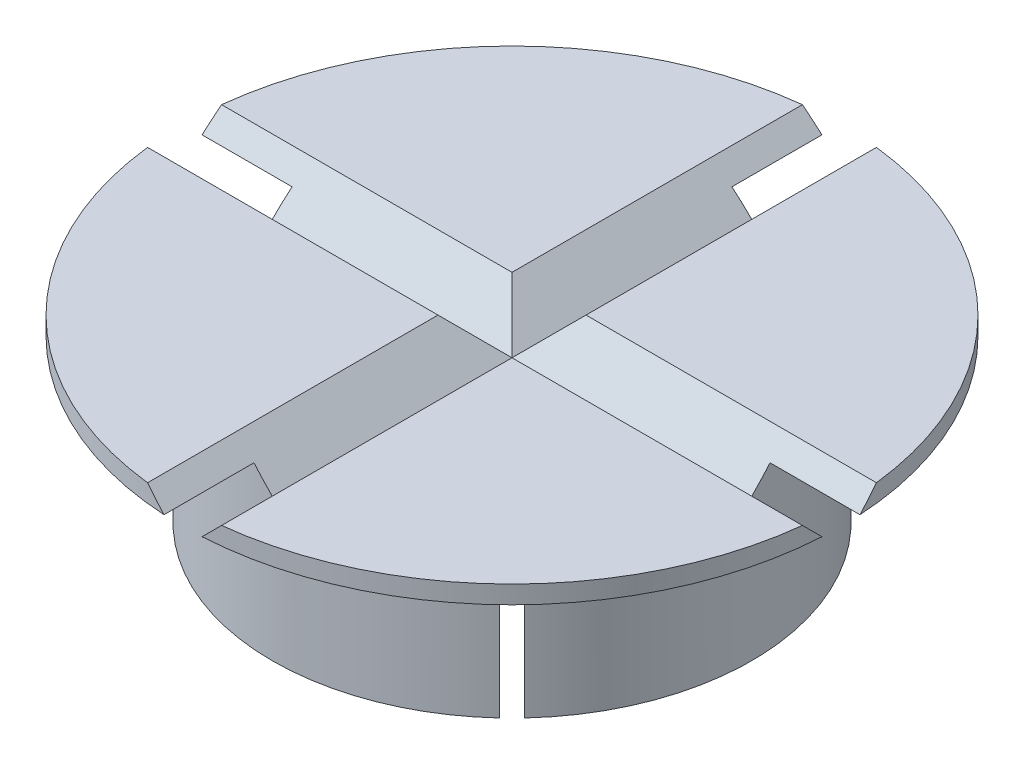
ISO-10303-21;
HEADER;
FILE_DESCRIPTION(('STEP AP214'),'2;1');
FILE_NAME('part.step','',(''),(''),'','','');
FILE_SCHEMA(('AUTOMOTIVE_DESIGN { 1 0 10303 214 1 1 1 1 }'));
ENDSEC;
DATA;
#1=APPLICATION_CONTEXT('core data for automotive mechanical design processes');
#2=APPLICATION_PROTOCOL_DEFINITION('international standard','automotive_design',2000,#1);
#3=PRODUCT_CONTEXT('',#1,'mechanical');
#4=PRODUCT('Part','Part','',(#3));
#5=PRODUCT_RELATED_PRODUCT_CATEGORY('part','',(#4));
#6=PRODUCT_DEFINITION_FORMATION('','',#4);
#7=PRODUCT_DEFINITION_CONTEXT('part definition',#1,'design');
#8=PRODUCT_DEFINITION('design','',#6,#7);
#9=PRODUCT_DEFINITION_SHAPE('','',#8);
#10=(LENGTH_UNIT() NAMED_UNIT(*) SI_UNIT(.MILLI.,.METRE.));
#11=(NAMED_UNIT(*) PLANE_ANGLE_UNIT() SI_UNIT($,.RADIAN.));
#12=(NAMED_UNIT(*) SI_UNIT($,.STERADIAN.) SOLID_ANGLE_UNIT());
#13=UNCERTAINTY_MEASURE_WITH_UNIT(LENGTH_MEASURE(1.E-05),#10,'distance_accuracy_value','');
#14=(GEOMETRIC_REPRESENTATION_CONTEXT(3) GLOBAL_UNCERTAINTY_ASSIGNED_CONTEXT((#13)) GLOBAL_UNIT_ASSIGNED_CONTEXT((#10,
#11,#12)) REPRESENTATION_CONTEXT('',''));
#15=CARTESIAN_POINT('',(0.,0.,0.));
#16=DIRECTION('',(0.,0.,1.));
#17=DIRECTION('',(1.,0.,0.));
#18=AXIS2_PLACEMENT_3D('',#15,#16,#17);
#19=CARTESIAN_POINT('',(0.,0.,0.));
#20=DIRECTION('',(0.,1.,0.));
#21=DIRECTION('',(0.,0.,1.));
#22=AXIS2_PLACEMENT_3D('',#19,#20,#21);
#23=PLANE('',#22);
#24=DIRECTION('',(-0.707106781186544,0.,0.707106781186551));
#25=VECTOR('',#24,1.);
#26=CARTESIAN_POINT('',(25.2340766922016,-3.2211462249284E-13,-26.6482902545749));
#27=LINE('',#26,#25);
#28=CARTESIAN_POINT('',(18.1593979295434,-2.36598536578077E-13,-19.5736114919167));
#29=VERTEX_POINT('',#28);
#30=CARTESIAN_POINT('',(16.0717862097112,-2.11364262460624E-13,-17.4859997720845));
#31=VERTEX_POINT('',#30);
#32=EDGE_CURVE('E263',#29,#31,#27,.T.);
#33=ORIENTED_EDGE('',*,*,#32,.T.);
#34=CARTESIAN_POINT('',(0.,0.,0.));
#35=DIRECTION('',(0.,-1.,0.));
#36=DIRECTION('',(0.,0.,-1.));
#37=AXIS2_PLACEMENT_3D('',#34,#35,#36);
#38=CIRCLE('',#37,23.75);
#39=CARTESIAN_POINT('',(-16.0717862097115,-2.02817018652179E-13,-17.4859997720841));
#40=VERTEX_POINT('',#39);
#41=EDGE_CURVE('E427',#40,#31,#38,.T.);
#42=ORIENTED_EDGE('',*,*,#41,.F.);
#43=DIRECTION('',(0.707106781186559,0.,0.707106781186536));
#44=VECTOR('',#43,1.);
#45=CARTESIAN_POINT('',(-25.2340766922021,-3.13567378684393E-13,-26.6482902545744));
#46=LINE('',#45,#44);
#47=CARTESIAN_POINT('',(-18.1593979295438,-2.28051292769631E-13,-19.5736114919163));
#48=VERTEX_POINT('',#47);
#49=EDGE_CURVE('E492',#48,#40,#46,.T.);
#50=ORIENTED_EDGE('',*,*,#49,.F.);
#51=CARTESIAN_POINT('',(0.,1.6306400674182E-13,0.));
#52=DIRECTION('',(0.,1.,0.));
#53=DIRECTION('',(0.,0.,1.));
#54=AXIS2_PLACEMENT_3D('',#51,#52,#53);
#55=CIRCLE('',#54,26.7);
#56=EDGE_CURVE('E271',#29,#48,#55,.T.);
#57=ORIENTED_EDGE('',*,*,#56,.F.);
#58=EDGE_LOOP('',(#33,#42,#50,#57));
#59=FACE_BOUND('',#58,.T.);
#60=ADVANCED_FACE('F35',(#59),#23,.F.);
#61=CARTESIAN_POINT('',(0.,20.,-1.20876281148109E-13));
#62=DIRECTION('',(0.,1.,0.));
#63=DIRECTION('',(0.,0.,1.));
#64=AXIS2_PLACEMENT_3D('',#61,#62,#63);
#65=CYLINDRICAL_SURFACE('',#64,26.6999999999999);
#66=CARTESIAN_POINT('',(0.,15.8786796564404,0.));
#67=DIRECTION('',(0.,-0.707106781186543,0.707106781186553));
#68=DIRECTION('',(0.,0.707106781186553,0.707106781186543));
#69=AXIS2_PLACEMENT_3D('',#66,#67,#68);
#70=ELLIPSE('',#69,37.7595021153616,26.6999999999999);
#71=CARTESIAN_POINT('',(-26.6155969311228,18.0000000000002,2.12132034355965));
#72=VERTEX_POINT('',#71);
#73=CARTESIAN_POINT('',(-26.6999999999999,15.8786796564405,0.));
#74=VERTEX_POINT('',#73);
#75=EDGE_CURVE('E394',#72,#74,#70,.T.);
#76=ORIENTED_EDGE('',*,*,#75,.T.);
#77=CARTESIAN_POINT('',(0.,15.8786796564404,0.));
#78=DIRECTION('',(0.,-0.707106781186551,-0.707106781186544));
#79=DIRECTION('',(0.,0.707106781186544,-0.707106781186551));
#80=AXIS2_PLACEMENT_3D('',#77,#78,#79);
#81=ELLIPSE('',#80,37.7595021153616,26.6999999999999);
#82=CARTESIAN_POINT('',(-26.6155969311228,18.0000000000002,-2.12132034355969));
#83=VERTEX_POINT('',#82);
#84=EDGE_CURVE('E387',#74,#83,#81,.T.);
#85=ORIENTED_EDGE('',*,*,#84,.T.);
#86=CARTESIAN_POINT('',(0.,18.0000000000002,-1.08788653033299E-13));
#87=DIRECTION('',(0.,1.,0.));
#88=DIRECTION('',(0.,0.,1.));
#89=AXIS2_PLACEMENT_3D('',#86,#87,#88);
#90=CIRCLE('',#89,26.6999999999999);
#91=CARTESIAN_POINT('',(-2.12132034355967,18.,-26.6155969311229));
#92=VERTEX_POINT('',#91);
#93=EDGE_CURVE('E284',#92,#83,#90,.T.);
#94=ORIENTED_EDGE('',*,*,#93,.F.);
#95=CARTESIAN_POINT('',(0.,15.8786796564404,0.));
#96=DIRECTION('',(-0.707106781186548,-0.707106781186547,0.));
#97=DIRECTION('',(-0.707106781186547,0.707106781186548,0.));
#98=AXIS2_PLACEMENT_3D('',#95,#96,#97);
#99=ELLIPSE('',#98,37.7595021153616,26.6999999999999);
#100=CARTESIAN_POINT('',(0.,15.8786796564404,-26.7));
#101=VERTEX_POINT('',#100);
#102=EDGE_CURVE('E355',#92,#101,#99,.T.);
#103=ORIENTED_EDGE('',*,*,#102,.T.);
#104=CARTESIAN_POINT('',(0.,15.8786796564404,0.));
#105=DIRECTION('',(0.707106781186548,-0.707106781186547,0.));
#106=DIRECTION('',(0.707106781186547,0.707106781186548,0.));
#107=AXIS2_PLACEMENT_3D('',#104,#105,#106);
#108=ELLIPSE('',#107,37.7595021153616,26.6999999999999);
#109=CARTESIAN_POINT('',(2.12132034355967,18.,-26.6155969311229));
#110=VERTEX_POINT('',#109);
#111=EDGE_CURVE('E339',#101,#110,#108,.T.);
#112=ORIENTED_EDGE('',*,*,#111,.T.);
#113=CARTESIAN_POINT('',(26.6155969311228,18.0000000000002,-2.12132034356019));
#114=VERTEX_POINT('',#113);
#115=EDGE_CURVE('E283',#114,#110,#90,.T.);
#116=ORIENTED_EDGE('',*,*,#115,.F.);
#117=CARTESIAN_POINT('',(0.,15.8786796564404,0.));
#118=DIRECTION('',(0.,-0.707106781186551,-0.707106781186544));
#119=DIRECTION('',(0.,0.707106781186544,-0.707106781186551));
#120=AXIS2_PLACEMENT_3D('',#117,#118,#119);
#121=ELLIPSE('',#120,37.7595021153616,26.6999999999999);
#122=CARTESIAN_POINT('',(26.6999999999999,15.8786796564402,-1.89190339067742E-13));
#123=VERTEX_POINT('',#122);
#124=EDGE_CURVE('E369',#114,#123,#121,.T.);
#125=ORIENTED_EDGE('',*,*,#124,.T.);
#126=CARTESIAN_POINT('',(0.,15.8786796564404,0.));
#127=DIRECTION('',(0.,-0.707106781186543,0.707106781186553));
#128=DIRECTION('',(0.,0.707106781186553,0.707106781186543));
#129=AXIS2_PLACEMENT_3D('',#126,#127,#128);
#130=ELLIPSE('',#129,37.7595021153616,26.6999999999999);
#131=CARTESIAN_POINT('',(26.6155969311228,18.0000000000002,2.12132034355979));
#132=VERTEX_POINT('',#131);
#133=EDGE_CURVE('E378',#123,#132,#130,.T.);
#134=ORIENTED_EDGE('',*,*,#133,.T.);
#135=CARTESIAN_POINT('',(2.12132034355999,18.0000000000003,26.6155969311227));
#136=VERTEX_POINT('',#135);
#137=EDGE_CURVE('E277',#136,#132,#90,.T.);
#138=ORIENTED_EDGE('',*,*,#137,.F.);
#139=CARTESIAN_POINT('',(0.,15.8786796564404,26.6999999999998));
#140=VERTEX_POINT('',#139);
#141=EDGE_CURVE('E331',#136,#140,#108,.T.);
#142=ORIENTED_EDGE('',*,*,#141,.T.);
#143=CARTESIAN_POINT('',(-2.12132034355999,18.0000000000003,26.6155969311227));
#144=VERTEX_POINT('',#143);
#145=EDGE_CURVE('E357',#140,#144,#99,.T.);
#146=ORIENTED_EDGE('',*,*,#145,.T.);
#147=EDGE_CURVE('E289',#72,#144,#90,.T.);
#148=ORIENTED_EDGE('',*,*,#147,.F.);
#149=EDGE_LOOP('',(#76,#85,#94,#103,#112,#116,#125,#134,#138,#142,#146,#148));
#150=FACE_BOUND('',#149,.T.);
#151=DIRECTION('',(0.,1.,0.));
#152=VECTOR('',#151,1.);
#153=CARTESIAN_POINT('',(18.1593979295433,19.9999999999999,-19.5736114919169));
#154=LINE('',#153,#152);
#155=CARTESIAN_POINT('',(18.1593979295434,11.9999999999998,-19.5736114919168));
#156=VERTEX_POINT('',#155);
#157=EDGE_CURVE('E498',#29,#156,#154,.T.);
#158=ORIENTED_EDGE('',*,*,#157,.F.);
#159=ORIENTED_EDGE('',*,*,#56,.T.);
#160=DIRECTION('',(0.,1.,0.));
#161=VECTOR('',#160,1.);
#162=CARTESIAN_POINT('',(-18.1593979295439,19.9999999999999,-19.5736114919164));
#163=LINE('',#162,#161);
#164=CARTESIAN_POINT('',(-18.1593979295438,11.9999999999998,-19.5736114919163));
#165=VERTEX_POINT('',#164);
#166=EDGE_CURVE('E463',#48,#165,#163,.T.);
#167=ORIENTED_EDGE('',*,*,#166,.T.);
#168=CARTESIAN_POINT('',(0.,12.,0.));
#169=DIRECTION('',(0.,-1.,0.));
#170=DIRECTION('',(1.,0.,0.));
#171=AXIS2_PLACEMENT_3D('',#168,#169,#170);
#172=CIRCLE('',#171,26.6999999999999);
#173=CARTESIAN_POINT('',(-19.5736114919169,11.9999999999998,-18.1593979295432));
#174=VERTEX_POINT('',#173);
#175=EDGE_CURVE('E452',#174,#165,#172,.T.);
#176=ORIENTED_EDGE('',*,*,#175,.F.);
#177=DIRECTION('',(0.,1.,0.));
#178=VECTOR('',#177,1.);
#179=CARTESIAN_POINT('',(-19.5736114919169,19.9999999999999,-18.1593979295432));
#180=LINE('',#179,#178);
#181=CARTESIAN_POINT('',(-19.5736114919169,-2.28051292769631E-13,-18.1593979295432));
#182=VERTEX_POINT('',#181);
#183=EDGE_CURVE('E459',#182,#174,#180,.T.);
#184=ORIENTED_EDGE('',*,*,#183,.F.);
#185=CARTESIAN_POINT('',(-19.5736114919165,0.,18.1593979295436));
#186=VERTEX_POINT('',#185);
#187=EDGE_CURVE('E273',#182,#186,#55,.T.);
#188=ORIENTED_EDGE('',*,*,#187,.T.);
#189=DIRECTION('',(0.,1.,0.));
#190=VECTOR('',#189,1.);
#191=CARTESIAN_POINT('',(-19.5736114919164,20.0000000000001,18.1593979295435));
#192=LINE('',#191,#190);
#193=CARTESIAN_POINT('',(-19.5736114919165,12.,18.1593979295436));
#194=VERTEX_POINT('',#193);
#195=EDGE_CURVE('E440',#186,#194,#192,.T.);
#196=ORIENTED_EDGE('',*,*,#195,.T.);
#197=CARTESIAN_POINT('',(0.,12.,0.));
#198=DIRECTION('',(0.,-1.,0.));
#199=DIRECTION('',(0.,0.,-1.));
#200=AXIS2_PLACEMENT_3D('',#197,#198,#199);
#201=CIRCLE('',#200,26.6999999999999);
#202=CARTESIAN_POINT('',(-18.1593979295434,12.,19.5736114919166));
#203=VERTEX_POINT('',#202);
#204=EDGE_CURVE('E432',#203,#194,#201,.T.);
#205=ORIENTED_EDGE('',*,*,#204,.F.);
#206=DIRECTION('',(0.,1.,0.));
#207=VECTOR('',#206,1.);
#208=CARTESIAN_POINT('',(-18.1593979295433,20.0000000000001,19.5736114919166));
#209=LINE('',#208,#207);
#210=CARTESIAN_POINT('',(-18.1593979295434,0.,19.5736114919167));
#211=VERTEX_POINT('',#210);
#212=EDGE_CURVE('E435',#211,#203,#209,.T.);
#213=ORIENTED_EDGE('',*,*,#212,.F.);
#214=CARTESIAN_POINT('',(18.1593979295437,0.,19.5736114919164));
#215=VERTEX_POINT('',#214);
#216=EDGE_CURVE('E270',#211,#215,#55,.T.);
#217=ORIENTED_EDGE('',*,*,#216,.T.);
#218=DIRECTION('',(0.,1.,0.));
#219=VECTOR('',#218,1.);
#220=CARTESIAN_POINT('',(18.1593979295437,20.0000000000001,19.5736114919162));
#221=LINE('',#220,#219);
#222=CARTESIAN_POINT('',(18.1593979295437,12.,19.5736114919163));
#223=VERTEX_POINT('',#222);
#224=EDGE_CURVE('E473',#215,#223,#221,.T.);
#225=ORIENTED_EDGE('',*,*,#224,.T.);
#226=CARTESIAN_POINT('',(0.,12.,0.));
#227=DIRECTION('',(0.,-1.,0.));
#228=DIRECTION('',(0.,0.,-1.));
#229=AXIS2_PLACEMENT_3D('',#226,#227,#228);
#230=CIRCLE('',#229,26.6999999999999);
#231=CARTESIAN_POINT('',(19.5736114919168,12.,18.1593979295432));
#232=VERTEX_POINT('',#231);
#233=EDGE_CURVE('E457',#232,#223,#230,.T.);
#234=ORIENTED_EDGE('',*,*,#233,.F.);
#235=DIRECTION('',(0.,1.,0.));
#236=VECTOR('',#235,1.);
#237=CARTESIAN_POINT('',(19.5736114919168,20.0000000000001,18.1593979295431));
#238=LINE('',#237,#236);
#239=CARTESIAN_POINT('',(19.5736114919167,0.,18.1593979295433));
#240=VERTEX_POINT('',#239);
#241=EDGE_CURVE('E269',#240,#232,#238,.T.);
#242=ORIENTED_EDGE('',*,*,#241,.F.);
#243=CARTESIAN_POINT('',(19.5736114919165,-2.19504048961189E-13,-18.1593979295436));
#244=VERTEX_POINT('',#243);
#245=EDGE_CURVE('E261',#240,#244,#55,.T.);
#246=ORIENTED_EDGE('',*,*,#245,.T.);
#247=DIRECTION('',(0.,1.,0.));
#248=VECTOR('',#247,1.);
#249=CARTESIAN_POINT('',(19.5736114919164,19.9999999999999,-18.1593979295438));
#250=LINE('',#249,#248);
#251=CARTESIAN_POINT('',(19.5736114919165,11.9999999999998,-18.1593979295437));
#252=VERTEX_POINT('',#251);
#253=EDGE_CURVE('E245',#244,#252,#250,.T.);
#254=ORIENTED_EDGE('',*,*,#253,.T.);
#255=CARTESIAN_POINT('',(0.,12.,0.));
#256=DIRECTION('',(0.,-1.,0.));
#257=DIRECTION('',(0.,0.,-1.));
#258=AXIS2_PLACEMENT_3D('',#255,#256,#257);
#259=CIRCLE('',#258,26.6999999999999);
#260=EDGE_CURVE('E494',#156,#252,#259,.T.);
#261=ORIENTED_EDGE('',*,*,#260,.F.);
#262=EDGE_LOOP('',(#158,#159,#167,#176,#184,#188,#196,#205,#213,#217,#225,#234,#242,#246,#254,#261));
#263=FACE_BOUND('',#262,.T.);
#264=ADVANCED_FACE('F267',(#150,#263),#65,.T.);
#265=CARTESIAN_POINT('',(0.,12.,0.));
#266=DIRECTION('',(0.,-1.,0.));
#267=DIRECTION('',(0.,0.,-1.));
#268=AXIS2_PLACEMENT_3D('',#265,#266,#267);
#269=CYLINDRICAL_SURFACE('',#268,23.75);
#270=DIRECTION('',(0.,-1.,0.));
#271=VECTOR('',#270,1.);
#272=CARTESIAN_POINT('',(16.0717862097112,11.9999999999999,-17.4859997720846));
#273=LINE('',#272,#271);
#274=CARTESIAN_POINT('',(16.0717862097112,11.9999999999998,-17.4859997720846));
#275=VERTEX_POINT('',#274);
#276=EDGE_CURVE('E253',#275,#31,#273,.T.);
#277=ORIENTED_EDGE('',*,*,#276,.F.);
#278=CARTESIAN_POINT('',(0.,12.,0.));
#279=DIRECTION('',(0.,-1.,0.));
#280=DIRECTION('',(0.,0.,-1.));
#281=AXIS2_PLACEMENT_3D('',#278,#279,#280);
#282=CIRCLE('',#281,23.75);
#283=CARTESIAN_POINT('',(-16.0717862097116,11.9999999999999,-17.4859997720842));
#284=VERTEX_POINT('',#283);
#285=EDGE_CURVE('E430',#284,#275,#282,.T.);
#286=ORIENTED_EDGE('',*,*,#285,.F.);
#287=DIRECTION('',(0.,-1.,0.));
#288=VECTOR('',#287,1.);
#289=CARTESIAN_POINT('',(-16.0717862097116,11.9999999999999,-17.4859997720842));
#290=LINE('',#289,#288);
#291=EDGE_CURVE('E466',#284,#40,#290,.T.);
#292=ORIENTED_EDGE('',*,*,#291,.T.);
#293=ORIENTED_EDGE('',*,*,#41,.T.);
#294=EDGE_LOOP('',(#277,#286,#292,#293));
#295=FACE_BOUND('',#294,.T.);
#296=ADVANCED_FACE('F514',(#295),#269,.F.);
#297=DIRECTION('',(0.707106781186559,0.,0.707106781186536));
#298=VECTOR('',#297,1.);
#299=CARTESIAN_POINT('',(-26.6482902545752,-3.13567378684393E-13,-25.2340766922013));
#300=LINE('',#299,#298);
#301=CARTESIAN_POINT('',(-17.4859997720846,-2.02817018652178E-13,-16.071786209711));
#302=VERTEX_POINT('',#301);
#303=EDGE_CURVE('E488',#182,#302,#300,.T.);
#304=ORIENTED_EDGE('',*,*,#303,.T.);
#305=CARTESIAN_POINT('',(-17.4859997720843,0.,16.0717862097114));
#306=VERTEX_POINT('',#305);
#307=EDGE_CURVE('E423',#306,#302,#38,.T.);
#308=ORIENTED_EDGE('',*,*,#307,.F.);
#309=DIRECTION('',(0.707106781186544,0.,-0.707106781186551));
#310=VECTOR('',#309,1.);
#311=CARTESIAN_POINT('',(-26.6482902545747,0.,25.2340766922018));
#312=LINE('',#311,#310);
#313=EDGE_CURVE('E450',#186,#306,#312,.T.);
#314=ORIENTED_EDGE('',*,*,#313,.F.);
#315=ORIENTED_EDGE('',*,*,#187,.F.);
#316=EDGE_LOOP('',(#304,#308,#314,#315));
#317=FACE_BOUND('',#316,.T.);
#318=ADVANCED_FACE('F561',(#317),#23,.F.);
#319=CARTESIAN_POINT('',(17.4859997720843,-1.94269774843737E-13,-16.0717862097114));
#320=VERTEX_POINT('',#319);
#321=CARTESIAN_POINT('',(17.4859997720845,0.,16.0717862097111));
#322=VERTEX_POINT('',#321);
#323=EDGE_CURVE('E262',#320,#322,#38,.T.);
#324=ORIENTED_EDGE('',*,*,#323,.F.);
#325=DIRECTION('',(-0.707106781186544,0.,0.707106781186551));
#326=VECTOR('',#325,1.);
#327=CARTESIAN_POINT('',(26.6482902545747,-3.05020134875953E-13,-25.2340766922018));
#328=LINE('',#327,#326);
#329=EDGE_CURVE('E248',#244,#320,#328,.T.);
#330=ORIENTED_EDGE('',*,*,#329,.F.);
#331=ORIENTED_EDGE('',*,*,#245,.F.);
#332=DIRECTION('',(-0.707106781186554,0.,-0.707106781186541));
#333=VECTOR('',#332,1.);
#334=CARTESIAN_POINT('',(26.648290254575,0.,25.2340766922015));
#335=LINE('',#334,#333);
#336=EDGE_CURVE('E480',#240,#322,#335,.T.);
#337=ORIENTED_EDGE('',*,*,#336,.T.);
#338=EDGE_LOOP('',(#324,#330,#331,#337));
#339=FACE_BOUND('',#338,.T.);
#340=ADVANCED_FACE('F259',(#339),#23,.F.);
#341=DIRECTION('',(0.,-1.,0.));
#342=VECTOR('',#341,1.);
#343=CARTESIAN_POINT('',(-17.4859997720846,11.9999999999999,-16.071786209711));
#344=LINE('',#343,#342);
#345=CARTESIAN_POINT('',(-17.4859997720847,11.9999999999998,-16.071786209711));
#346=VERTEX_POINT('',#345);
#347=EDGE_CURVE('E461',#346,#302,#344,.T.);
#348=ORIENTED_EDGE('',*,*,#347,.F.);
#349=CARTESIAN_POINT('',(-17.4859997720843,12.0000000000001,16.0717862097113));
#350=VERTEX_POINT('',#349);
#351=EDGE_CURVE('E422',#350,#346,#282,.T.);
#352=ORIENTED_EDGE('',*,*,#351,.F.);
#353=DIRECTION('',(0.,-1.,0.));
#354=VECTOR('',#353,1.);
#355=CARTESIAN_POINT('',(-17.4859997720843,12.0000000000001,16.0717862097113));
#356=LINE('',#355,#354);
#357=EDGE_CURVE('E442',#350,#306,#356,.T.);
#358=ORIENTED_EDGE('',*,*,#357,.T.);
#359=ORIENTED_EDGE('',*,*,#307,.T.);
#360=EDGE_LOOP('',(#348,#352,#358,#359));
#361=FACE_BOUND('',#360,.T.);
#362=ADVANCED_FACE('F550',(#361),#269,.F.);
#363=CARTESIAN_POINT('',(17.4859997720843,11.9999999999999,-16.0717862097115));
#364=VERTEX_POINT('',#363);
#365=CARTESIAN_POINT('',(17.4859997720845,12.,16.071786209711));
#366=VERTEX_POINT('',#365);
#367=EDGE_CURVE('E431',#364,#366,#282,.T.);
#368=ORIENTED_EDGE('',*,*,#367,.F.);
#369=DIRECTION('',(0.,-1.,0.));
#370=VECTOR('',#369,1.);
#371=CARTESIAN_POINT('',(17.4859997720843,11.9999999999999,-16.0717862097115));
#372=LINE('',#371,#370);
#373=EDGE_CURVE('E254',#364,#320,#372,.T.);
#374=ORIENTED_EDGE('',*,*,#373,.T.);
#375=ORIENTED_EDGE('',*,*,#323,.T.);
#376=DIRECTION('',(0.,-1.,0.));
#377=VECTOR('',#376,1.);
#378=CARTESIAN_POINT('',(17.4859997720845,12.0000000000001,16.071786209711));
#379=LINE('',#378,#377);
#380=EDGE_CURVE('E470',#366,#322,#379,.T.);
#381=ORIENTED_EDGE('',*,*,#380,.F.);
#382=EDGE_LOOP('',(#368,#374,#375,#381));
#383=FACE_BOUND('',#382,.T.);
#384=ADVANCED_FACE('F534',(#383),#269,.F.);
#385=CARTESIAN_POINT('',(16.0717862097114,0.,17.4859997720842));
#386=VERTEX_POINT('',#385);
#387=CARTESIAN_POINT('',(-16.0717862097112,0.,17.4859997720845));
#388=VERTEX_POINT('',#387);
#389=EDGE_CURVE('E434',#386,#388,#38,.T.);
#390=ORIENTED_EDGE('',*,*,#389,.F.);
#391=DIRECTION('',(-0.707106781186554,0.,-0.707106781186541));
#392=VECTOR('',#391,1.);
#393=CARTESIAN_POINT('',(25.2340766922019,0.,26.6482902545746));
#394=LINE('',#393,#392);
#395=EDGE_CURVE('E482',#215,#386,#394,.T.);
#396=ORIENTED_EDGE('',*,*,#395,.F.);
#397=ORIENTED_EDGE('',*,*,#216,.F.);
#398=DIRECTION('',(0.707106781186544,0.,-0.707106781186551));
#399=VECTOR('',#398,1.);
#400=CARTESIAN_POINT('',(-25.2340766922016,0.,26.6482902545749));
#401=LINE('',#400,#399);
#402=EDGE_CURVE('E446',#211,#388,#401,.T.);
#403=ORIENTED_EDGE('',*,*,#402,.T.);
#404=EDGE_LOOP('',(#390,#396,#397,#403));
#405=FACE_BOUND('',#404,.T.);
#406=ADVANCED_FACE('F37',(#405),#23,.F.);
#407=CARTESIAN_POINT('',(16.0717862097115,12.0000000000001,17.4859997720841));
#408=VERTEX_POINT('',#407);
#409=CARTESIAN_POINT('',(-16.0717862097112,12.,17.4859997720844));
#410=VERTEX_POINT('',#409);
#411=EDGE_CURVE('E426',#408,#410,#282,.T.);
#412=ORIENTED_EDGE('',*,*,#411,.F.);
#413=DIRECTION('',(0.,-1.,0.));
#414=VECTOR('',#413,1.);
#415=CARTESIAN_POINT('',(16.0717862097115,12.0000000000001,17.4859997720841));
#416=LINE('',#415,#414);
#417=EDGE_CURVE('E476',#408,#386,#416,.T.);
#418=ORIENTED_EDGE('',*,*,#417,.T.);
#419=ORIENTED_EDGE('',*,*,#389,.T.);
#420=DIRECTION('',(0.,-1.,0.));
#421=VECTOR('',#420,1.);
#422=CARTESIAN_POINT('',(-16.0717862097112,12.0000000000001,17.4859997720844));
#423=LINE('',#422,#421);
#424=EDGE_CURVE('E437',#410,#388,#423,.T.);
#425=ORIENTED_EDGE('',*,*,#424,.F.);
#426=EDGE_LOOP('',(#412,#418,#419,#425));
#427=FACE_BOUND('',#426,.T.);
#428=ADVANCED_FACE('F527',(#427),#269,.F.);
#429=CARTESIAN_POINT('',(0.,18.,-26.7));
#430=DIRECTION('',(0.,1.,0.));
#431=DIRECTION('',(0.,0.,1.));
#432=AXIS2_PLACEMENT_3D('',#429,#430,#431);
#433=PLANE('',#432);
#434=CARTESIAN_POINT('',(0.,18.0000000000002,-1.08788653033299E-13));
#435=DIRECTION('',(0.,1.,0.));
#436=DIRECTION('',(0.,0.,1.));
#437=AXIS2_PLACEMENT_3D('',#434,#435,#436);
#438=CIRCLE('',#437,36.6999999999999);
#439=CARTESIAN_POINT('',(36.6386408044839,18.0000000000002,-2.12132034356032));
#440=VERTEX_POINT('',#439);
#441=CARTESIAN_POINT('',(2.12132034355964,18.,-36.638640804484));
#442=VERTEX_POINT('',#441);
#443=EDGE_CURVE('E303',#440,#442,#438,.T.);
#444=ORIENTED_EDGE('',*,*,#443,.F.);
#445=DIRECTION('',(-1.,0.,0.));
#446=VECTOR('',#445,1.);
#447=CARTESIAN_POINT('',(2.34364970973921E-13,18.0000000000002,-2.12132034355994));
#448=LINE('',#447,#446);
#449=EDGE_CURVE('E372',#440,#114,#448,.T.);
#450=ORIENTED_EDGE('',*,*,#449,.T.);
#451=ORIENTED_EDGE('',*,*,#115,.T.);
#452=DIRECTION('',(0.,0.,-1.));
#453=VECTOR('',#452,1.);
#454=CARTESIAN_POINT('',(2.12132034355967,18.,-26.7));
#455=LINE('',#454,#453);
#456=EDGE_CURVE('E344',#110,#442,#455,.T.);
#457=ORIENTED_EDGE('',*,*,#456,.T.);
#458=EDGE_LOOP('',(#444,#450,#451,#457));
#459=FACE_BOUND('',#458,.T.);
#460=ADVANCED_FACE('F572',(#459),#433,.F.);
#461=CARTESIAN_POINT('',(0.,20.,-1.20876281148109E-13));
#462=DIRECTION('',(0.,1.,0.));
#463=DIRECTION('',(0.,0.,1.));
#464=AXIS2_PLACEMENT_3D('',#461,#462,#463);
#465=CYLINDRICAL_SURFACE('',#464,36.6999999999999);
#466=CARTESIAN_POINT('',(0.,20.0000000000002,-1.2087628114811E-13));
#467=DIRECTION('',(0.,1.,0.));
#468=DIRECTION('',(0.,0.,1.));
#469=AXIS2_PLACEMENT_3D('',#466,#467,#468);
#470=CIRCLE('',#469,36.6999999999999);
#471=CARTESIAN_POINT('',(-36.4678587063424,20.0000000000002,4.12132034355964));
#472=VERTEX_POINT('',#471);
#473=CARTESIAN_POINT('',(-4.12132034355963,20.,36.4678587063422));
#474=VERTEX_POINT('',#473);
#475=EDGE_CURVE('E325',#472,#474,#470,.T.);
#476=ORIENTED_EDGE('',*,*,#475,.F.);
#477=CARTESIAN_POINT('',(0.,15.8786796564404,0.));
#478=DIRECTION('',(0.,-0.707106781186543,0.707106781186553));
#479=DIRECTION('',(0.,0.707106781186553,0.707106781186543));
#480=AXIS2_PLACEMENT_3D('',#477,#478,#479);
#481=ELLIPSE('',#480,51.9016377390925,36.6999999999999);
#482=CARTESIAN_POINT('',(-36.6386408044839,18.0000000000002,2.12132034355963));
#483=VERTEX_POINT('',#482);
#484=EDGE_CURVE('E392',#472,#483,#481,.T.);
#485=ORIENTED_EDGE('',*,*,#484,.T.);
#486=CARTESIAN_POINT('',(-2.12132034356008,18.0000000000005,36.6386408044837));
#487=VERTEX_POINT('',#486);
#488=EDGE_CURVE('E309',#483,#487,#438,.T.);
#489=ORIENTED_EDGE('',*,*,#488,.T.);
#490=CARTESIAN_POINT('',(0.,15.8786796564404,0.));
#491=DIRECTION('',(-0.707106781186548,-0.707106781186547,0.));
#492=DIRECTION('',(-0.707106781186547,0.707106781186548,0.));
#493=AXIS2_PLACEMENT_3D('',#490,#491,#492);
#494=ELLIPSE('',#493,51.9016377390925,36.6999999999999);
#495=EDGE_CURVE('E362',#487,#474,#494,.T.);
#496=ORIENTED_EDGE('',*,*,#495,.T.);
#497=EDGE_LOOP('',(#476,#485,#489,#496));
#498=FACE_BOUND('',#497,.T.);
#499=ADVANCED_FACE('F775',(#498),#465,.T.);
#500=CARTESIAN_POINT('',(0.,19.9999999999999,-36.7));
#501=DIRECTION('',(0.,-1.,0.));
#502=DIRECTION('',(0.,0.,-1.));
#503=AXIS2_PLACEMENT_3D('',#500,#501,#502);
#504=PLANE('',#503);
#505=DIRECTION('',(0.,0.,1.));
#506=VECTOR('',#505,1.);
#507=CARTESIAN_POINT('',(4.12132034355953,19.9999999999999,-36.7));
#508=LINE('',#507,#506);
#509=CARTESIAN_POINT('',(4.12132034355963,20.,-36.4678587063425));
#510=VERTEX_POINT('',#509);
#511=CARTESIAN_POINT('',(4.12132034355967,20.,-4.12132034355979));
#512=VERTEX_POINT('',#511);
#513=EDGE_CURVE('E11',#510,#512,#508,.T.);
#514=ORIENTED_EDGE('',*,*,#513,.T.);
#515=DIRECTION('',(1.,0.,0.));
#516=VECTOR('',#515,1.);
#517=CARTESIAN_POINT('',(-36.7,20.0000000000002,-4.12132034355962));
#518=LINE('',#517,#516);
#519=CARTESIAN_POINT('',(36.4678587063424,19.9999999999998,-4.12132034355988));
#520=VERTEX_POINT('',#519);
#521=EDGE_CURVE('E407',#512,#520,#518,.T.);
#522=ORIENTED_EDGE('',*,*,#521,.T.);
#523=EDGE_CURVE('E323',#520,#510,#470,.T.);
#524=ORIENTED_EDGE('',*,*,#523,.T.);
#525=EDGE_LOOP('',(#514,#522,#524));
#526=FACE_BOUND('',#525,.T.);
#527=ADVANCED_FACE('F763',(#526),#504,.F.);
#528=ORIENTED_EDGE('',*,*,#93,.T.);
#529=DIRECTION('',(-1.,0.,0.));
#530=VECTOR('',#529,1.);
#531=CARTESIAN_POINT('',(2.34364970973921E-13,18.0000000000002,-2.12132034355994));
#532=LINE('',#531,#530);
#533=CARTESIAN_POINT('',(-36.6386408044839,18.0000000000002,-2.12132034355959));
#534=VERTEX_POINT('',#533);
#535=EDGE_CURVE('E390',#83,#534,#532,.T.);
#536=ORIENTED_EDGE('',*,*,#535,.T.);
#537=CARTESIAN_POINT('',(-2.12132034355964,18.,-36.638640804484));
#538=VERTEX_POINT('',#537);
#539=EDGE_CURVE('E304',#538,#534,#438,.T.);
#540=ORIENTED_EDGE('',*,*,#539,.F.);
#541=DIRECTION('',(0.,0.,1.));
#542=VECTOR('',#541,1.);
#543=CARTESIAN_POINT('',(-2.12132034355967,18.,-26.7));
#544=LINE('',#543,#542);
#545=EDGE_CURVE('E363',#538,#92,#544,.T.);
#546=ORIENTED_EDGE('',*,*,#545,.T.);
#547=EDGE_LOOP('',(#528,#536,#540,#546));
#548=FACE_BOUND('',#547,.T.);
#549=ADVANCED_FACE('F807',(#548),#433,.F.);
#550=ORIENTED_EDGE('',*,*,#523,.F.);
#551=CARTESIAN_POINT('',(0.,15.8786796564404,0.));
#552=DIRECTION('',(0.,-0.707106781186551,-0.707106781186544));
#553=DIRECTION('',(0.,0.707106781186544,-0.707106781186551));
#554=AXIS2_PLACEMENT_3D('',#551,#552,#553);
#555=ELLIPSE('',#554,51.9016377390925,36.6999999999999);
#556=EDGE_CURVE('E375',#520,#440,#555,.T.);
#557=ORIENTED_EDGE('',*,*,#556,.T.);
#558=ORIENTED_EDGE('',*,*,#443,.T.);
#559=CARTESIAN_POINT('',(0.,15.8786796564404,0.));
#560=DIRECTION('',(0.707106781186548,-0.707106781186547,0.));
#561=DIRECTION('',(0.707106781186547,0.707106781186548,0.));
#562=AXIS2_PLACEMENT_3D('',#559,#560,#561);
#563=ELLIPSE('',#562,51.9016377390925,36.6999999999999);
#564=EDGE_CURVE('E349',#442,#510,#563,.T.);
#565=ORIENTED_EDGE('',*,*,#564,.T.);
#566=EDGE_LOOP('',(#550,#557,#558,#565));
#567=FACE_BOUND('',#566,.T.);
#568=ADVANCED_FACE('F800',(#567),#465,.T.);
#569=CARTESIAN_POINT('',(-4.12132034355953,20.,-36.4678587063425));
#570=VERTEX_POINT('',#569);
#571=CARTESIAN_POINT('',(-36.4678587063424,20.0000000000002,-4.12132034355962));
#572=VERTEX_POINT('',#571);
#573=EDGE_CURVE('E324',#570,#572,#470,.T.);
#574=ORIENTED_EDGE('',*,*,#573,.T.);
#575=CARTESIAN_POINT('',(-4.12132034355963,20.,-4.12132034355971));
#576=VERTEX_POINT('',#575);
#577=EDGE_CURVE('E399',#572,#576,#518,.T.);
#578=ORIENTED_EDGE('',*,*,#577,.T.);
#579=DIRECTION('',(0.,0.,-1.));
#580=VECTOR('',#579,1.);
#581=CARTESIAN_POINT('',(-4.12132034355953,19.9999999999999,-36.7));
#582=LINE('',#581,#580);
#583=EDGE_CURVE('E275',#576,#570,#582,.T.);
#584=ORIENTED_EDGE('',*,*,#583,.T.);
#585=EDGE_LOOP('',(#574,#578,#584));
#586=FACE_BOUND('',#585,.T.);
#587=ADVANCED_FACE('F792',(#586),#504,.F.);
#588=CARTESIAN_POINT('',(4.12132034355963,20.,-36.7));
#589=DIRECTION('',(0.707106781186548,-0.707106781186547,0.));
#590=DIRECTION('',(0.707106781186547,0.707106781186548,0.));
#591=AXIS2_PLACEMENT_3D('',#588,#589,#590);
#592=PLANE('',#591);
#593=DIRECTION('',(0.,0.,1.));
#594=VECTOR('',#593,1.);
#595=CARTESIAN_POINT('',(0.,15.8786796564404,-36.7));
#596=LINE('',#595,#594);
#597=CARTESIAN_POINT('',(0.,15.8786796564404,0.));
#598=VERTEX_POINT('',#597);
#599=EDGE_CURVE('E365',#101,#598,#596,.T.);
#600=ORIENTED_EDGE('',*,*,#599,.T.);
#601=DIRECTION('',(0.577350269189627,0.577350269189621,-0.577350269189629));
#602=VECTOR('',#601,1.);
#603=CARTESIAN_POINT('',(-12.2128802681613,3.66579938827923,12.2128802681612));
#604=LINE('',#603,#602);
#605=EDGE_CURVE('E413',#598,#512,#604,.T.);
#606=ORIENTED_EDGE('',*,*,#605,.T.);
#607=ORIENTED_EDGE('',*,*,#513,.F.);
#608=ORIENTED_EDGE('',*,*,#564,.F.);
#609=ORIENTED_EDGE('',*,*,#456,.F.);
#610=ORIENTED_EDGE('',*,*,#111,.F.);
#611=EDGE_LOOP('',(#600,#606,#607,#608,#609,#610));
#612=FACE_BOUND('',#611,.T.);
#613=ADVANCED_FACE('F752',(#612),#592,.F.);
#614=CARTESIAN_POINT('',(0.,15.8786796564404,-36.7));
#615=DIRECTION('',(-0.707106781186548,-0.707106781186547,0.));
#616=DIRECTION('',(0.707106781186547,-0.707106781186548,0.));
#617=AXIS2_PLACEMENT_3D('',#614,#615,#616);
#618=PLANE('',#617);
#619=ORIENTED_EDGE('',*,*,#583,.F.);
#620=DIRECTION('',(0.577350269189628,-0.577350269189623,0.577350269189626));
#621=VECTOR('',#620,1.);
#622=CARTESIAN_POINT('',(9.46533337245476,6.41334628398569,9.46533337245462));
#623=LINE('',#622,#621);
#624=EDGE_CURVE('E419',#576,#598,#623,.T.);
#625=ORIENTED_EDGE('',*,*,#624,.T.);
#626=ORIENTED_EDGE('',*,*,#599,.F.);
#627=ORIENTED_EDGE('',*,*,#102,.F.);
#628=ORIENTED_EDGE('',*,*,#545,.F.);
#629=EDGE_CURVE('E359',#570,#538,#494,.T.);
#630=ORIENTED_EDGE('',*,*,#629,.F.);
#631=EDGE_LOOP('',(#619,#625,#626,#627,#628,#630));
#632=FACE_BOUND('',#631,.T.);
#633=ADVANCED_FACE('F740',(#632),#618,.F.);
#634=ORIENTED_EDGE('',*,*,#137,.T.);
#635=DIRECTION('',(1.,0.,0.));
#636=VECTOR('',#635,1.);
#637=CARTESIAN_POINT('',(0.,18.0000000000002,2.12132034355972));
#638=LINE('',#637,#636);
#639=CARTESIAN_POINT('',(36.6386408044839,18.0000000000002,2.12132034355985));
#640=VERTEX_POINT('',#639);
#641=EDGE_CURVE('E381',#132,#640,#638,.T.);
#642=ORIENTED_EDGE('',*,*,#641,.T.);
#643=CARTESIAN_POINT('',(2.12132034356008,18.0000000000005,36.6386408044838));
#644=VERTEX_POINT('',#643);
#645=EDGE_CURVE('E296',#644,#640,#438,.T.);
#646=ORIENTED_EDGE('',*,*,#645,.F.);
#647=EDGE_CURVE('E338',#644,#136,#455,.T.);
#648=ORIENTED_EDGE('',*,*,#647,.T.);
#649=EDGE_LOOP('',(#634,#642,#646,#648));
#650=FACE_BOUND('',#649,.T.);
#651=ADVANCED_FACE('F785',(#650),#433,.F.);
#652=ORIENTED_EDGE('',*,*,#539,.T.);
#653=CARTESIAN_POINT('',(0.,15.8786796564404,0.));
#654=DIRECTION('',(0.,-0.707106781186551,-0.707106781186544));
#655=DIRECTION('',(0.,0.707106781186544,-0.707106781186551));
#656=AXIS2_PLACEMENT_3D('',#653,#654,#655);
#657=ELLIPSE('',#656,51.9016377390925,36.6999999999999);
#658=EDGE_CURVE('E385',#534,#572,#657,.T.);
#659=ORIENTED_EDGE('',*,*,#658,.T.);
#660=ORIENTED_EDGE('',*,*,#573,.F.);
#661=ORIENTED_EDGE('',*,*,#629,.T.);
#662=EDGE_LOOP('',(#652,#659,#660,#661));
#663=FACE_BOUND('',#662,.T.);
#664=ADVANCED_FACE('F776',(#663),#465,.T.);
#665=CARTESIAN_POINT('',(4.12132034355963,20.,36.4678587063422));
#666=VERTEX_POINT('',#665);
#667=CARTESIAN_POINT('',(36.4678587063424,19.9999999999998,4.12132034355938));
#668=VERTEX_POINT('',#667);
#669=EDGE_CURVE('E316',#666,#668,#470,.T.);
#670=ORIENTED_EDGE('',*,*,#669,.T.);
#671=DIRECTION('',(1.,0.,0.));
#672=VECTOR('',#671,1.);
#673=CARTESIAN_POINT('',(-36.7,20.0000000000002,4.12132034355964));
#674=LINE('',#673,#672);
#675=CARTESIAN_POINT('',(4.12132034355963,20.,4.1213203435595));
#676=VERTEX_POINT('',#675);
#677=EDGE_CURVE('E403',#676,#668,#674,.T.);
#678=ORIENTED_EDGE('',*,*,#677,.F.);
#679=EDGE_CURVE('E43',#676,#666,#508,.T.);
#680=ORIENTED_EDGE('',*,*,#679,.T.);
#681=EDGE_LOOP('',(#670,#678,#680));
#682=FACE_BOUND('',#681,.T.);
#683=ADVANCED_FACE('F764',(#682),#504,.F.);
#684=ORIENTED_EDGE('',*,*,#488,.F.);
#685=DIRECTION('',(1.,0.,0.));
#686=VECTOR('',#685,1.);
#687=CARTESIAN_POINT('',(0.,18.0000000000002,2.12132034355972));
#688=LINE('',#687,#686);
#689=EDGE_CURVE('E397',#483,#72,#688,.T.);
#690=ORIENTED_EDGE('',*,*,#689,.T.);
#691=ORIENTED_EDGE('',*,*,#147,.T.);
#692=EDGE_CURVE('E360',#144,#487,#544,.T.);
#693=ORIENTED_EDGE('',*,*,#692,.T.);
#694=EDGE_LOOP('',(#684,#690,#691,#693));
#695=FACE_BOUND('',#694,.T.);
#696=ADVANCED_FACE('F773',(#695),#433,.F.);
#697=ORIENTED_EDGE('',*,*,#645,.T.);
#698=CARTESIAN_POINT('',(0.,15.8786796564404,0.));
#699=DIRECTION('',(0.,-0.707106781186543,0.707106781186553));
#700=DIRECTION('',(0.,0.707106781186553,0.707106781186543));
#701=AXIS2_PLACEMENT_3D('',#698,#699,#700);
#702=ELLIPSE('',#701,51.9016377390925,36.6999999999999);
#703=EDGE_CURVE('E383',#640,#668,#702,.T.);
#704=ORIENTED_EDGE('',*,*,#703,.T.);
#705=ORIENTED_EDGE('',*,*,#669,.F.);
#706=EDGE_CURVE('E342',#666,#644,#563,.T.);
#707=ORIENTED_EDGE('',*,*,#706,.T.);
#708=EDGE_LOOP('',(#697,#704,#705,#707));
#709=FACE_BOUND('',#708,.T.);
#710=ADVANCED_FACE('F761',(#709),#465,.T.);
#711=CARTESIAN_POINT('',(-4.12132034355978,20.0000000000001,4.12132034355958));
#712=VERTEX_POINT('',#711);
#713=EDGE_CURVE('E884',#474,#712,#582,.T.);
#714=ORIENTED_EDGE('',*,*,#713,.T.);
#715=EDGE_CURVE('E400',#472,#712,#674,.T.);
#716=ORIENTED_EDGE('',*,*,#715,.F.);
#717=ORIENTED_EDGE('',*,*,#475,.T.);
#718=EDGE_LOOP('',(#714,#716,#717));
#719=FACE_BOUND('',#718,.T.);
#720=ADVANCED_FACE('F749',(#719),#504,.F.);
#721=ORIENTED_EDGE('',*,*,#679,.F.);
#722=DIRECTION('',(-0.577350269189626,-0.577350269189635,-0.577350269189617));
#723=VECTOR('',#722,1.);
#724=CARTESIAN_POINT('',(12.2128802681613,28.0915599246018,12.212880268161));
#725=LINE('',#724,#723);
#726=EDGE_CURVE('E410',#676,#598,#725,.T.);
#727=ORIENTED_EDGE('',*,*,#726,.T.);
#728=EDGE_CURVE('E368',#598,#140,#596,.T.);
#729=ORIENTED_EDGE('',*,*,#728,.T.);
#730=ORIENTED_EDGE('',*,*,#141,.F.);
#731=ORIENTED_EDGE('',*,*,#647,.F.);
#732=ORIENTED_EDGE('',*,*,#706,.F.);
#733=EDGE_LOOP('',(#721,#727,#729,#730,#731,#732));
#734=FACE_BOUND('',#733,.T.);
#735=ADVANCED_FACE('F737',(#734),#592,.F.);
#736=ORIENTED_EDGE('',*,*,#728,.F.);
#737=DIRECTION('',(-0.57735026918962,0.577350269189628,0.577350269189629));
#738=VECTOR('',#737,1.);
#739=CARTESIAN_POINT('',(-14.9604271638678,30.8391068203083,14.9604271638679));
#740=LINE('',#739,#738);
#741=EDGE_CURVE('E416',#598,#712,#740,.T.);
#742=ORIENTED_EDGE('',*,*,#741,.T.);
#743=ORIENTED_EDGE('',*,*,#713,.F.);
#744=ORIENTED_EDGE('',*,*,#495,.F.);
#745=ORIENTED_EDGE('',*,*,#692,.F.);
#746=ORIENTED_EDGE('',*,*,#145,.F.);
#747=EDGE_LOOP('',(#736,#742,#743,#744,#745,#746));
#748=FACE_BOUND('',#747,.T.);
#749=ADVANCED_FACE('F727',(#748),#618,.F.);
#750=CARTESIAN_POINT('',(-36.7,15.8786796564406,0.));
#751=DIRECTION('',(0.,-0.707106781186543,0.707106781186553));
#752=DIRECTION('',(0.,-0.707106781186553,-0.707106781186543));
#753=AXIS2_PLACEMENT_3D('',#750,#751,#752);
#754=PLANE('',#753);
#755=ORIENTED_EDGE('',*,*,#715,.T.);
#756=ORIENTED_EDGE('',*,*,#741,.F.);
#757=DIRECTION('',(1.,0.,0.));
#758=VECTOR('',#757,1.);
#759=CARTESIAN_POINT('',(-36.7,15.8786796564406,0.));
#760=LINE('',#759,#758);
#761=EDGE_CURVE('E404',#74,#598,#760,.T.);
#762=ORIENTED_EDGE('',*,*,#761,.F.);
#763=ORIENTED_EDGE('',*,*,#75,.F.);
#764=ORIENTED_EDGE('',*,*,#689,.F.);
#765=ORIENTED_EDGE('',*,*,#484,.F.);
#766=EDGE_LOOP('',(#755,#756,#762,#763,#764,#765));
#767=FACE_BOUND('',#766,.T.);
#768=ADVANCED_FACE('F702',(#767),#754,.F.);
#769=CARTESIAN_POINT('',(-36.7,20.0000000000002,-4.12132034355962));
#770=DIRECTION('',(0.,-0.707106781186551,-0.707106781186544));
#771=DIRECTION('',(0.,0.707106781186544,-0.707106781186551));
#772=AXIS2_PLACEMENT_3D('',#769,#770,#771);
#773=PLANE('',#772);
#774=ORIENTED_EDGE('',*,*,#535,.F.);
#775=ORIENTED_EDGE('',*,*,#84,.F.);
#776=ORIENTED_EDGE('',*,*,#761,.T.);
#777=ORIENTED_EDGE('',*,*,#624,.F.);
#778=ORIENTED_EDGE('',*,*,#577,.F.);
#779=ORIENTED_EDGE('',*,*,#658,.F.);
#780=EDGE_LOOP('',(#774,#775,#776,#777,#778,#779));
#781=FACE_BOUND('',#780,.T.);
#782=ADVANCED_FACE('F710',(#781),#773,.F.);
#783=ORIENTED_EDGE('',*,*,#449,.F.);
#784=ORIENTED_EDGE('',*,*,#556,.F.);
#785=ORIENTED_EDGE('',*,*,#521,.F.);
#786=ORIENTED_EDGE('',*,*,#605,.F.);
#787=EDGE_CURVE('E402',#598,#123,#760,.T.);
#788=ORIENTED_EDGE('',*,*,#787,.T.);
#789=ORIENTED_EDGE('',*,*,#124,.F.);
#790=EDGE_LOOP('',(#783,#784,#785,#786,#788,#789));
#791=FACE_BOUND('',#790,.T.);
#792=ADVANCED_FACE('F699',(#791),#773,.F.);
#793=ORIENTED_EDGE('',*,*,#787,.F.);
#794=ORIENTED_EDGE('',*,*,#726,.F.);
#795=ORIENTED_EDGE('',*,*,#677,.T.);
#796=ORIENTED_EDGE('',*,*,#703,.F.);
#797=ORIENTED_EDGE('',*,*,#641,.F.);
#798=ORIENTED_EDGE('',*,*,#133,.F.);
#799=EDGE_LOOP('',(#793,#794,#795,#796,#797,#798));
#800=FACE_BOUND('',#799,.T.);
#801=ADVANCED_FACE('F628',(#800),#754,.F.);
#802=CARTESIAN_POINT('',(0.,12.,0.));
#803=DIRECTION('',(0.,-1.,0.));
#804=DIRECTION('',(0.,0.,-1.));
#805=AXIS2_PLACEMENT_3D('',#802,#803,#804);
#806=PLANE('',#805);
#807=ORIENTED_EDGE('',*,*,#285,.T.);
#808=DIRECTION('',(-0.707106781186544,0.,0.707106781186551));
#809=VECTOR('',#808,1.);
#810=CARTESIAN_POINT('',(25.2340766922016,11.9999999999997,-26.6482902545751));
#811=LINE('',#810,#809);
#812=EDGE_CURVE('E502',#156,#275,#811,.T.);
#813=ORIENTED_EDGE('',*,*,#812,.F.);
#814=ORIENTED_EDGE('',*,*,#260,.T.);
#815=DIRECTION('',(-0.707106781186544,0.,0.707106781186551));
#816=VECTOR('',#815,1.);
#817=CARTESIAN_POINT('',(26.6482902545747,11.9999999999997,-25.234076692202));
#818=LINE('',#817,#816);
#819=EDGE_CURVE('E50',#252,#364,#818,.T.);
#820=ORIENTED_EDGE('',*,*,#819,.T.);
#821=ORIENTED_EDGE('',*,*,#367,.T.);
#822=DIRECTION('',(-0.707106781186554,0.,-0.707106781186541));
#823=VECTOR('',#822,1.);
#824=CARTESIAN_POINT('',(26.6482902545751,12.,25.2340766922014));
#825=LINE('',#824,#823);
#826=EDGE_CURVE('E479',#232,#366,#825,.T.);
#827=ORIENTED_EDGE('',*,*,#826,.F.);
#828=ORIENTED_EDGE('',*,*,#233,.T.);
#829=DIRECTION('',(-0.707106781186554,0.,-0.707106781186541));
#830=VECTOR('',#829,1.);
#831=CARTESIAN_POINT('',(25.234076692202,12.,26.6482902545745));
#832=LINE('',#831,#830);
#833=EDGE_CURVE('E57',#223,#408,#832,.T.);
#834=ORIENTED_EDGE('',*,*,#833,.T.);
#835=ORIENTED_EDGE('',*,*,#411,.T.);
#836=DIRECTION('',(0.707106781186544,0.,-0.707106781186551));
#837=VECTOR('',#836,1.);
#838=CARTESIAN_POINT('',(-25.2340766922016,12.,26.6482902545749));
#839=LINE('',#838,#837);
#840=EDGE_CURVE('E445',#203,#410,#839,.T.);
#841=ORIENTED_EDGE('',*,*,#840,.F.);
#842=ORIENTED_EDGE('',*,*,#204,.T.);
#843=DIRECTION('',(0.707106781186544,0.,-0.707106781186551));
#844=VECTOR('',#843,1.);
#845=CARTESIAN_POINT('',(-26.6482902545747,12.,25.2340766922018));
#846=LINE('',#845,#844);
#847=EDGE_CURVE('E449',#194,#350,#846,.T.);
#848=ORIENTED_EDGE('',*,*,#847,.T.);
#849=ORIENTED_EDGE('',*,*,#351,.T.);
#850=DIRECTION('',(0.707106781186559,0.,0.707106781186536));
#851=VECTOR('',#850,1.);
#852=CARTESIAN_POINT('',(-26.6482902545753,11.9999999999997,-25.2340766922014));
#853=LINE('',#852,#851);
#854=EDGE_CURVE('E484',#174,#346,#853,.T.);
#855=ORIENTED_EDGE('',*,*,#854,.F.);
#856=ORIENTED_EDGE('',*,*,#175,.T.);
#857=DIRECTION('',(0.707106781186559,0.,0.707106781186536));
#858=VECTOR('',#857,1.);
#859=CARTESIAN_POINT('',(-25.2340766922022,11.9999999999997,-26.6482902545745));
#860=LINE('',#859,#858);
#861=EDGE_CURVE('E491',#165,#284,#860,.T.);
#862=ORIENTED_EDGE('',*,*,#861,.T.);
#863=EDGE_LOOP('',(#807,#813,#814,#820,#821,#827,#828,#834,#835,#841,#842,#848,#849,#855,#856,#862));
#864=FACE_BOUND('',#863,.T.);
#865=ADVANCED_FACE('F516',(#864),#806,.T.);
#866=CARTESIAN_POINT('',(-25.2340766922016,12.,26.6482902545749));
#867=DIRECTION('',(-0.707106781186551,0.,-0.707106781186544));
#868=DIRECTION('',(-0.707106781186544,0.,0.707106781186551));
#869=AXIS2_PLACEMENT_3D('',#866,#867,#868);
#870=PLANE('',#869);
#871=ORIENTED_EDGE('',*,*,#212,.T.);
#872=ORIENTED_EDGE('',*,*,#840,.T.);
#873=ORIENTED_EDGE('',*,*,#424,.T.);
#874=ORIENTED_EDGE('',*,*,#402,.F.);
#875=EDGE_LOOP('',(#871,#872,#873,#874));
#876=FACE_BOUND('',#875,.T.);
#877=ADVANCED_FACE('F525',(#876),#870,.T.);
#878=CARTESIAN_POINT('',(-26.6482902545747,12.,25.2340766922018));
#879=DIRECTION('',(-0.707106781186551,0.,-0.707106781186544));
#880=DIRECTION('',(-0.707106781186544,0.,0.707106781186551));
#881=AXIS2_PLACEMENT_3D('',#878,#879,#880);
#882=PLANE('',#881);
#883=ORIENTED_EDGE('',*,*,#313,.T.);
#884=ORIENTED_EDGE('',*,*,#357,.F.);
#885=ORIENTED_EDGE('',*,*,#847,.F.);
#886=ORIENTED_EDGE('',*,*,#195,.F.);
#887=EDGE_LOOP('',(#883,#884,#885,#886));
#888=FACE_BOUND('',#887,.T.);
#889=ADVANCED_FACE('F544',(#888),#882,.F.);
#890=CARTESIAN_POINT('',(26.6482902545751,12.,25.2340766922014));
#891=DIRECTION('',(-0.707106781186541,0.,0.707106781186554));
#892=DIRECTION('',(0.707106781186554,0.,0.707106781186541));
#893=AXIS2_PLACEMENT_3D('',#890,#891,#892);
#894=PLANE('',#893);
#895=ORIENTED_EDGE('',*,*,#241,.T.);
#896=ORIENTED_EDGE('',*,*,#826,.T.);
#897=ORIENTED_EDGE('',*,*,#380,.T.);
#898=ORIENTED_EDGE('',*,*,#336,.F.);
#899=EDGE_LOOP('',(#895,#896,#897,#898));
#900=FACE_BOUND('',#899,.T.);
#901=ADVANCED_FACE('F536',(#900),#894,.T.);
#902=CARTESIAN_POINT('',(25.234076692202,12.,26.6482902545745));
#903=DIRECTION('',(-0.707106781186541,0.,0.707106781186554));
#904=DIRECTION('',(0.707106781186554,0.,0.707106781186541));
#905=AXIS2_PLACEMENT_3D('',#902,#903,#904);
#906=PLANE('',#905);
#907=ORIENTED_EDGE('',*,*,#395,.T.);
#908=ORIENTED_EDGE('',*,*,#417,.F.);
#909=ORIENTED_EDGE('',*,*,#833,.F.);
#910=ORIENTED_EDGE('',*,*,#224,.F.);
#911=EDGE_LOOP('',(#907,#908,#909,#910));
#912=FACE_BOUND('',#911,.T.);
#913=ADVANCED_FACE('F540',(#912),#906,.F.);
#914=CARTESIAN_POINT('',(-26.6482902545753,11.9999999999997,-25.2340766922014));
#915=DIRECTION('',(0.707106781186536,0.,-0.707106781186559));
#916=DIRECTION('',(-0.707106781186559,0.,-0.707106781186536));
#917=AXIS2_PLACEMENT_3D('',#914,#915,#916);
#918=PLANE('',#917);
#919=ORIENTED_EDGE('',*,*,#183,.T.);
#920=ORIENTED_EDGE('',*,*,#854,.T.);
#921=ORIENTED_EDGE('',*,*,#347,.T.);
#922=ORIENTED_EDGE('',*,*,#303,.F.);
#923=EDGE_LOOP('',(#919,#920,#921,#922));
#924=FACE_BOUND('',#923,.T.);
#925=ADVANCED_FACE('F648',(#924),#918,.T.);
#926=CARTESIAN_POINT('',(-25.2340766922022,11.9999999999997,-26.6482902545745));
#927=DIRECTION('',(0.707106781186536,0.,-0.707106781186559));
#928=DIRECTION('',(-0.707106781186559,0.,-0.707106781186536));
#929=AXIS2_PLACEMENT_3D('',#926,#927,#928);
#930=PLANE('',#929);
#931=ORIENTED_EDGE('',*,*,#49,.T.);
#932=ORIENTED_EDGE('',*,*,#291,.F.);
#933=ORIENTED_EDGE('',*,*,#861,.F.);
#934=ORIENTED_EDGE('',*,*,#166,.F.);
#935=EDGE_LOOP('',(#931,#932,#933,#934));
#936=FACE_BOUND('',#935,.T.);
#937=ADVANCED_FACE('F558',(#936),#930,.F.);
#938=CARTESIAN_POINT('',(25.2340766922016,11.9999999999997,-26.6482902545751));
#939=DIRECTION('',(0.707106781186551,0.,0.707106781186544));
#940=DIRECTION('',(0.707106781186544,0.,-0.707106781186551));
#941=AXIS2_PLACEMENT_3D('',#938,#939,#940);
#942=PLANE('',#941);
#943=ORIENTED_EDGE('',*,*,#157,.T.);
#944=ORIENTED_EDGE('',*,*,#812,.T.);
#945=ORIENTED_EDGE('',*,*,#276,.T.);
#946=ORIENTED_EDGE('',*,*,#32,.F.);
#947=EDGE_LOOP('',(#943,#944,#945,#946));
#948=FACE_BOUND('',#947,.T.);
#949=ADVANCED_FACE('F509',(#948),#942,.T.);
#950=CARTESIAN_POINT('',(26.6482902545747,11.9999999999997,-25.234076692202));
#951=DIRECTION('',(0.707106781186551,0.,0.707106781186544));
#952=DIRECTION('',(0.707106781186544,0.,-0.707106781186551));
#953=AXIS2_PLACEMENT_3D('',#950,#951,#952);
#954=PLANE('',#953);
#955=ORIENTED_EDGE('',*,*,#329,.T.);
#956=ORIENTED_EDGE('',*,*,#373,.F.);
#957=ORIENTED_EDGE('',*,*,#819,.F.);
#958=ORIENTED_EDGE('',*,*,#253,.F.);
#959=EDGE_LOOP('',(#955,#956,#957,#958));
#960=FACE_BOUND('',#959,.T.);
#961=ADVANCED_FACE('F247',(#960),#954,.F.);
#962=CLOSED_SHELL('',(#60,#264,#296,#318,#340,#362,#384,#406,#428,#460,#499,#527,#549,#568,#587,
#613,#633,#651,#664,#683,#696,#710,#720,#735,#749,#768,#782,#792,#801,#865,#877,#889,#901,#913,
#925,#937,#949,#961));
#963=MANIFOLD_SOLID_BREP('B2',#962);
#964=ADVANCED_BREP_SHAPE_REPRESENTATION('',(#18,#963),#14);
#965=SHAPE_DEFINITION_REPRESENTATION(#9,#964);
ENDSEC;
END-ISO-10303-21;
